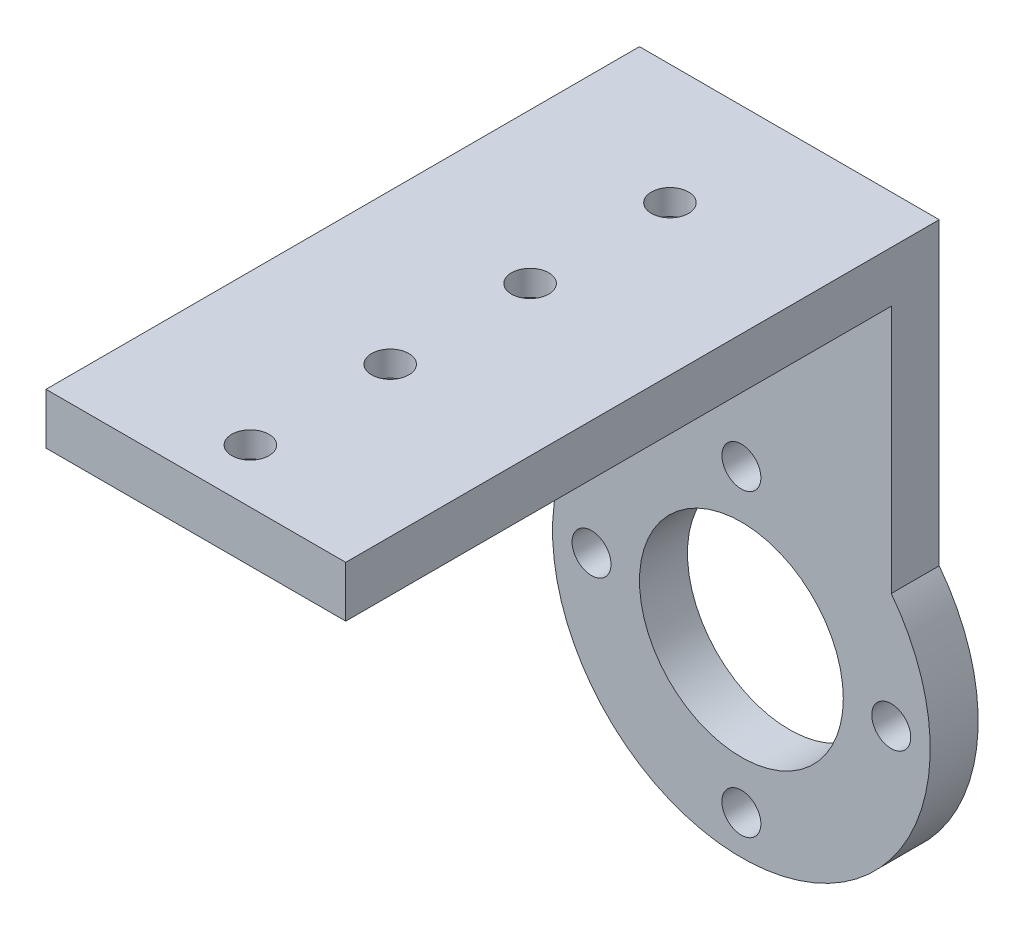
ISO-10303-21;
HEADER;
FILE_DESCRIPTION(('STEP AP214'),'2;1');
FILE_NAME('part.step','',(''),(''),'','','');
FILE_SCHEMA(('AUTOMOTIVE_DESIGN { 1 0 10303 214 1 1 1 1 }'));
ENDSEC;
DATA;
#1=APPLICATION_CONTEXT('core data for automotive mechanical design processes');
#2=APPLICATION_PROTOCOL_DEFINITION('international standard','automotive_design',2000,#1);
#3=PRODUCT_CONTEXT('',#1,'mechanical');
#4=PRODUCT('Part','Part','',(#3));
#5=PRODUCT_RELATED_PRODUCT_CATEGORY('part','',(#4));
#6=PRODUCT_DEFINITION_FORMATION('','',#4);
#7=PRODUCT_DEFINITION_CONTEXT('part definition',#1,'design');
#8=PRODUCT_DEFINITION('design','',#6,#7);
#9=PRODUCT_DEFINITION_SHAPE('','',#8);
#10=(LENGTH_UNIT() NAMED_UNIT(*) SI_UNIT(.MILLI.,.METRE.));
#11=(NAMED_UNIT(*) PLANE_ANGLE_UNIT() SI_UNIT($,.RADIAN.));
#12=(NAMED_UNIT(*) SI_UNIT($,.STERADIAN.) SOLID_ANGLE_UNIT());
#13=UNCERTAINTY_MEASURE_WITH_UNIT(LENGTH_MEASURE(1.E-05),#10,'distance_accuracy_value','');
#14=(GEOMETRIC_REPRESENTATION_CONTEXT(3) GLOBAL_UNCERTAINTY_ASSIGNED_CONTEXT((#13)) GLOBAL_UNIT_ASSIGNED_CONTEXT((#10,
#11,#12)) REPRESENTATION_CONTEXT('',''));
#15=CARTESIAN_POINT('',(0.,0.,0.));
#16=DIRECTION('',(0.,0.,1.));
#17=DIRECTION('',(1.,0.,0.));
#18=AXIS2_PLACEMENT_3D('',#15,#16,#17);
#19=CARTESIAN_POINT('',(0.0883987136924592,70.6637678967368,20.));
#20=DIRECTION('',(0.,-1.,0.));
#21=DIRECTION('',(0.,0.,-1.));
#22=AXIS2_PLACEMENT_3D('',#19,#20,#21);
#23=CYLINDRICAL_SURFACE('',#22,3.1);
#24=CARTESIAN_POINT('',(0.0883987136924592,69.1637678967368,20.));
#25=DIRECTION('',(0.,1.,0.));
#26=DIRECTION('',(0.,0.,1.));
#27=AXIS2_PLACEMENT_3D('',#24,#25,#26);
#28=CIRCLE('',#27,3.1);
#29=CARTESIAN_POINT('',(0.0883987136924592,69.1637678967368,23.1));
#30=VERTEX_POINT('',#29);
#31=EDGE_CURVE('E114',#30,#30,#28,.T.);
#32=ORIENTED_EDGE('',*,*,#31,.T.);
#33=EDGE_LOOP('',(#32));
#34=FACE_BOUND('',#33,.T.);
#35=CARTESIAN_POINT('',(0.0883987136924592,64.9637678967368,20.));
#36=DIRECTION('',(0.,-1.,0.));
#37=DIRECTION('',(0.,0.,-1.));
#38=AXIS2_PLACEMENT_3D('',#35,#36,#37);
#39=CIRCLE('',#38,3.1);
#40=CARTESIAN_POINT('',(0.0883987136924592,64.9637678967368,16.9));
#41=VERTEX_POINT('',#40);
#42=EDGE_CURVE('E476',#41,#41,#39,.T.);
#43=ORIENTED_EDGE('',*,*,#42,.T.);
#44=EDGE_LOOP('',(#43));
#45=FACE_BOUND('',#44,.T.);
#46=ADVANCED_FACE('F37',(#34,#45),#23,.F.);
#47=CARTESIAN_POINT('',(0.0883987136924592,70.6637678967368,43.333));
#48=DIRECTION('',(0.,-1.,0.));
#49=DIRECTION('',(0.,0.,-1.));
#50=AXIS2_PLACEMENT_3D('',#47,#48,#49);
#51=CYLINDRICAL_SURFACE('',#50,3.1);
#52=CARTESIAN_POINT('',(0.0883987136924592,69.1637678967368,43.333));
#53=DIRECTION('',(0.,1.,0.));
#54=DIRECTION('',(0.,0.,1.));
#55=AXIS2_PLACEMENT_3D('',#52,#53,#54);
#56=CIRCLE('',#55,3.1);
#57=CARTESIAN_POINT('',(0.0883987136924592,69.1637678967368,46.433));
#58=VERTEX_POINT('',#57);
#59=EDGE_CURVE('E119',#58,#58,#56,.T.);
#60=ORIENTED_EDGE('',*,*,#59,.T.);
#61=EDGE_LOOP('',(#60));
#62=FACE_BOUND('',#61,.T.);
#63=CARTESIAN_POINT('',(0.0883987136924592,64.9637678967368,43.333));
#64=DIRECTION('',(0.,-1.,0.));
#65=DIRECTION('',(0.,0.,-1.));
#66=AXIS2_PLACEMENT_3D('',#63,#64,#65);
#67=CIRCLE('',#66,3.1);
#68=CARTESIAN_POINT('',(0.0883987136924592,64.9637678967368,40.233));
#69=VERTEX_POINT('',#68);
#70=EDGE_CURVE('E465',#69,#69,#67,.T.);
#71=ORIENTED_EDGE('',*,*,#70,.T.);
#72=EDGE_LOOP('',(#71));
#73=FACE_BOUND('',#72,.T.);
#74=ADVANCED_FACE('F211',(#62,#73),#51,.F.);
#75=CARTESIAN_POINT('',(0.0883987136924592,70.6637678967368,66.66667));
#76=DIRECTION('',(0.,-1.,0.));
#77=DIRECTION('',(0.,0.,-1.));
#78=AXIS2_PLACEMENT_3D('',#75,#76,#77);
#79=CYLINDRICAL_SURFACE('',#78,3.10000000000001);
#80=CARTESIAN_POINT('',(0.0883987136924592,69.1637678967368,66.66667));
#81=DIRECTION('',(0.,1.,0.));
#82=DIRECTION('',(0.,0.,1.));
#83=AXIS2_PLACEMENT_3D('',#80,#81,#82);
#84=CIRCLE('',#83,3.10000000000001);
#85=CARTESIAN_POINT('',(0.0883987136924592,69.1637678967368,69.76667));
#86=VERTEX_POINT('',#85);
#87=EDGE_CURVE('E136',#86,#86,#84,.T.);
#88=ORIENTED_EDGE('',*,*,#87,.T.);
#89=EDGE_LOOP('',(#88));
#90=FACE_BOUND('',#89,.T.);
#91=CARTESIAN_POINT('',(0.0883987136924592,64.9637678967368,66.66667));
#92=DIRECTION('',(0.,-1.,0.));
#93=DIRECTION('',(0.,0.,-1.));
#94=AXIS2_PLACEMENT_3D('',#91,#92,#93);
#95=CIRCLE('',#94,3.10000000000001);
#96=CARTESIAN_POINT('',(0.0883987136924592,64.9637678967368,63.56667));
#97=VERTEX_POINT('',#96);
#98=EDGE_CURVE('E122',#97,#97,#95,.T.);
#99=ORIENTED_EDGE('',*,*,#98,.T.);
#100=EDGE_LOOP('',(#99));
#101=FACE_BOUND('',#100,.T.);
#102=ADVANCED_FACE('F217',(#90,#101),#79,.F.);
#103=CARTESIAN_POINT('',(0.0883987136924592,70.6637678967368,90.));
#104=DIRECTION('',(0.,-1.,0.));
#105=DIRECTION('',(0.,0.,-1.));
#106=AXIS2_PLACEMENT_3D('',#103,#104,#105);
#107=CYLINDRICAL_SURFACE('',#106,3.10000000000001);
#108=CARTESIAN_POINT('',(0.0883987136924592,69.1637678967368,90.));
#109=DIRECTION('',(0.,1.,0.));
#110=DIRECTION('',(0.,0.,1.));
#111=AXIS2_PLACEMENT_3D('',#108,#109,#110);
#112=CIRCLE('',#111,3.10000000000001);
#113=CARTESIAN_POINT('',(0.0883987136924592,69.1637678967368,93.1));
#114=VERTEX_POINT('',#113);
#115=EDGE_CURVE('E139',#114,#114,#112,.T.);
#116=ORIENTED_EDGE('',*,*,#115,.T.);
#117=EDGE_LOOP('',(#116));
#118=FACE_BOUND('',#117,.T.);
#119=CARTESIAN_POINT('',(0.0883987136924592,64.9637678967368,90.));
#120=DIRECTION('',(0.,-1.,0.));
#121=DIRECTION('',(0.,0.,-1.));
#122=AXIS2_PLACEMENT_3D('',#119,#120,#121);
#123=CIRCLE('',#122,3.10000000000001);
#124=CARTESIAN_POINT('',(0.0883987136924592,64.9637678967368,86.9));
#125=VERTEX_POINT('',#124);
#126=EDGE_CURVE('E112',#125,#125,#123,.F.);
#127=ORIENTED_EDGE('',*,*,#126,.F.);
#128=EDGE_LOOP('',(#127));
#129=FACE_BOUND('',#128,.T.);
#130=ADVANCED_FACE('F206',(#118,#129),#107,.F.);
#131=CARTESIAN_POINT('',(0.,0.,8.));
#132=DIRECTION('',(0.,0.,-1.));
#133=DIRECTION('',(-1.,0.,0.));
#134=AXIS2_PLACEMENT_3D('',#131,#132,#133);
#135=CYLINDRICAL_SURFACE('',#134,31.5);
#136=DIRECTION('',(0.,0.,-1.));
#137=VECTOR('',#136,1.);
#138=CARTESIAN_POINT('',(25.,19.1637678967368,4.));
#139=LINE('',#138,#137);
#140=CARTESIAN_POINT('',(25.,19.1637678967368,8.));
#141=VERTEX_POINT('',#140);
#142=CARTESIAN_POINT('',(25.,19.1637678967368,0.));
#143=VERTEX_POINT('',#142);
#144=EDGE_CURVE('E88',#141,#143,#139,.T.);
#145=ORIENTED_EDGE('',*,*,#144,.F.);
#146=CARTESIAN_POINT('',(0.,0.,8.));
#147=DIRECTION('',(0.,0.,1.));
#148=DIRECTION('',(1.,0.,0.));
#149=AXIS2_PLACEMENT_3D('',#146,#147,#148);
#150=CIRCLE('',#149,31.5);
#151=CARTESIAN_POINT('',(-25.,19.1637678967368,8.));
#152=VERTEX_POINT('',#151);
#153=EDGE_CURVE('E45',#152,#141,#150,.T.);
#154=ORIENTED_EDGE('',*,*,#153,.F.);
#155=DIRECTION('',(0.,0.,-1.));
#156=VECTOR('',#155,1.);
#157=CARTESIAN_POINT('',(-25.,19.1637678967368,4.));
#158=LINE('',#157,#156);
#159=CARTESIAN_POINT('',(-25.,19.1637678967368,0.));
#160=VERTEX_POINT('',#159);
#161=EDGE_CURVE('E164',#152,#160,#158,.T.);
#162=ORIENTED_EDGE('',*,*,#161,.T.);
#163=CARTESIAN_POINT('',(0.,0.,0.));
#164=DIRECTION('',(0.,0.,1.));
#165=DIRECTION('',(1.,0.,0.));
#166=AXIS2_PLACEMENT_3D('',#163,#164,#165);
#167=CIRCLE('',#166,31.5);
#168=EDGE_CURVE('E59',#160,#143,#167,.T.);
#169=ORIENTED_EDGE('',*,*,#168,.T.);
#170=EDGE_LOOP('',(#145,#154,#162,#169));
#171=FACE_BOUND('',#170,.T.);
#172=ADVANCED_FACE('F39',(#171),#135,.T.);
#173=CARTESIAN_POINT('',(0.,0.,8.));
#174=DIRECTION('',(0.,0.,1.));
#175=DIRECTION('',(1.,0.,0.));
#176=AXIS2_PLACEMENT_3D('',#173,#174,#175);
#177=PLANE('',#176);
#178=CARTESIAN_POINT('',(0.,0.,8.));
#179=DIRECTION('',(0.,0.,1.));
#180=DIRECTION('',(1.,0.,0.));
#181=AXIS2_PLACEMENT_3D('',#178,#179,#180);
#182=CIRCLE('',#181,17.);
#183=CARTESIAN_POINT('',(17.,0.,8.));
#184=VERTEX_POINT('',#183);
#185=EDGE_CURVE('E101',#184,#184,#182,.T.);
#186=ORIENTED_EDGE('',*,*,#185,.F.);
#187=EDGE_LOOP('',(#186));
#188=FACE_BOUND('',#187,.T.);
#189=CARTESIAN_POINT('',(0.,25.,8.));
#190=DIRECTION('',(0.,0.,1.));
#191=DIRECTION('',(1.,0.,0.));
#192=AXIS2_PLACEMENT_3D('',#189,#190,#191);
#193=CIRCLE('',#192,3.25);
#194=CARTESIAN_POINT('',(3.25000000000001,25.,8.));
#195=VERTEX_POINT('',#194);
#196=EDGE_CURVE('E107',#195,#195,#193,.T.);
#197=ORIENTED_EDGE('',*,*,#196,.F.);
#198=EDGE_LOOP('',(#197));
#199=FACE_BOUND('',#198,.T.);
#200=CARTESIAN_POINT('',(25.,0.,8.));
#201=DIRECTION('',(0.,0.,1.));
#202=DIRECTION('',(1.,0.,0.));
#203=AXIS2_PLACEMENT_3D('',#200,#201,#202);
#204=CIRCLE('',#203,3.25);
#205=CARTESIAN_POINT('',(28.25,0.,8.));
#206=VERTEX_POINT('',#205);
#207=EDGE_CURVE('E179',#206,#206,#204,.T.);
#208=ORIENTED_EDGE('',*,*,#207,.F.);
#209=EDGE_LOOP('',(#208));
#210=FACE_BOUND('',#209,.T.);
#211=CARTESIAN_POINT('',(0.,-25.,8.));
#212=DIRECTION('',(0.,0.,1.));
#213=DIRECTION('',(1.,0.,0.));
#214=AXIS2_PLACEMENT_3D('',#211,#212,#213);
#215=CIRCLE('',#214,3.25);
#216=CARTESIAN_POINT('',(3.25000000000001,-25.,8.));
#217=VERTEX_POINT('',#216);
#218=EDGE_CURVE('E185',#217,#217,#215,.T.);
#219=ORIENTED_EDGE('',*,*,#218,.F.);
#220=EDGE_LOOP('',(#219));
#221=FACE_BOUND('',#220,.T.);
#222=CARTESIAN_POINT('',(-25.,0.,8.));
#223=DIRECTION('',(0.,0.,1.));
#224=DIRECTION('',(1.,0.,0.));
#225=AXIS2_PLACEMENT_3D('',#222,#223,#224);
#226=CIRCLE('',#225,3.25);
#227=CARTESIAN_POINT('',(-21.75,0.,8.));
#228=VERTEX_POINT('',#227);
#229=EDGE_CURVE('E110',#228,#228,#226,.T.);
#230=ORIENTED_EDGE('',*,*,#229,.F.);
#231=EDGE_LOOP('',(#230));
#232=FACE_BOUND('',#231,.T.);
#233=ORIENTED_EDGE('',*,*,#153,.T.);
#234=DIRECTION('',(0.,-1.,0.));
#235=VECTOR('',#234,1.);
#236=CARTESIAN_POINT('',(25.,0.,8.));
#237=LINE('',#236,#235);
#238=CARTESIAN_POINT('',(25.,60.6637678967368,8.00000000000001));
#239=VERTEX_POINT('',#238);
#240=EDGE_CURVE('E52',#239,#141,#237,.T.);
#241=ORIENTED_EDGE('',*,*,#240,.F.);
#242=DIRECTION('',(1.,0.,0.));
#243=VECTOR('',#242,1.);
#244=CARTESIAN_POINT('',(-25.,60.6637678967368,8.00000000000001));
#245=LINE('',#244,#243);
#246=CARTESIAN_POINT('',(-25.,60.6637678967368,8.));
#247=VERTEX_POINT('',#246);
#248=EDGE_CURVE('E11',#247,#239,#245,.T.);
#249=ORIENTED_EDGE('',*,*,#248,.F.);
#250=DIRECTION('',(0.,-1.,0.));
#251=VECTOR('',#250,1.);
#252=CARTESIAN_POINT('',(-25.,0.,8.));
#253=LINE('',#252,#251);
#254=EDGE_CURVE('E100',#247,#152,#253,.T.);
#255=ORIENTED_EDGE('',*,*,#254,.T.);
#256=EDGE_LOOP('',(#233,#241,#249,#255));
#257=FACE_BOUND('',#256,.T.);
#258=ADVANCED_FACE('F104',(#188,#199,#210,#221,#232,#257),#177,.T.);
#259=CARTESIAN_POINT('',(0.,0.,0.));
#260=DIRECTION('',(0.,0.,1.));
#261=DIRECTION('',(1.,0.,0.));
#262=AXIS2_PLACEMENT_3D('',#259,#260,#261);
#263=PLANE('',#262);
#264=CARTESIAN_POINT('',(0.,0.,0.));
#265=DIRECTION('',(0.,0.,1.));
#266=DIRECTION('',(1.,0.,0.));
#267=AXIS2_PLACEMENT_3D('',#264,#265,#266);
#268=CIRCLE('',#267,17.);
#269=CARTESIAN_POINT('',(17.,0.,0.));
#270=VERTEX_POINT('',#269);
#271=EDGE_CURVE('E92',#270,#270,#268,.T.);
#272=ORIENTED_EDGE('',*,*,#271,.T.);
#273=EDGE_LOOP('',(#272));
#274=FACE_BOUND('',#273,.T.);
#275=CARTESIAN_POINT('',(0.,25.,0.));
#276=DIRECTION('',(0.,0.,1.));
#277=DIRECTION('',(1.,0.,0.));
#278=AXIS2_PLACEMENT_3D('',#275,#276,#277);
#279=CIRCLE('',#278,3.25);
#280=CARTESIAN_POINT('',(3.25000000000001,25.,0.));
#281=VERTEX_POINT('',#280);
#282=EDGE_CURVE('E173',#281,#281,#279,.T.);
#283=ORIENTED_EDGE('',*,*,#282,.T.);
#284=EDGE_LOOP('',(#283));
#285=FACE_BOUND('',#284,.T.);
#286=CARTESIAN_POINT('',(25.,0.,0.));
#287=DIRECTION('',(0.,0.,1.));
#288=DIRECTION('',(1.,0.,0.));
#289=AXIS2_PLACEMENT_3D('',#286,#287,#288);
#290=CIRCLE('',#289,3.25);
#291=CARTESIAN_POINT('',(28.25,0.,0.));
#292=VERTEX_POINT('',#291);
#293=EDGE_CURVE('E176',#292,#292,#290,.T.);
#294=ORIENTED_EDGE('',*,*,#293,.T.);
#295=EDGE_LOOP('',(#294));
#296=FACE_BOUND('',#295,.T.);
#297=CARTESIAN_POINT('',(0.,-25.,0.));
#298=DIRECTION('',(0.,0.,1.));
#299=DIRECTION('',(1.,0.,0.));
#300=AXIS2_PLACEMENT_3D('',#297,#298,#299);
#301=CIRCLE('',#300,3.25);
#302=CARTESIAN_POINT('',(3.25000000000001,-25.,0.));
#303=VERTEX_POINT('',#302);
#304=EDGE_CURVE('E182',#303,#303,#301,.T.);
#305=ORIENTED_EDGE('',*,*,#304,.T.);
#306=EDGE_LOOP('',(#305));
#307=FACE_BOUND('',#306,.T.);
#308=CARTESIAN_POINT('',(-25.,0.,0.));
#309=DIRECTION('',(0.,0.,1.));
#310=DIRECTION('',(1.,0.,0.));
#311=AXIS2_PLACEMENT_3D('',#308,#309,#310);
#312=CIRCLE('',#311,3.25);
#313=CARTESIAN_POINT('',(-21.75,0.,0.));
#314=VERTEX_POINT('',#313);
#315=EDGE_CURVE('E187',#314,#314,#312,.T.);
#316=ORIENTED_EDGE('',*,*,#315,.T.);
#317=EDGE_LOOP('',(#316));
#318=FACE_BOUND('',#317,.T.);
#319=ORIENTED_EDGE('',*,*,#168,.F.);
#320=DIRECTION('',(0.,-1.,0.));
#321=VECTOR('',#320,1.);
#322=CARTESIAN_POINT('',(-25.,0.,0.));
#323=LINE('',#322,#321);
#324=CARTESIAN_POINT('',(-25.,69.1637678967368,0.));
#325=VERTEX_POINT('',#324);
#326=EDGE_CURVE('E161',#325,#160,#323,.T.);
#327=ORIENTED_EDGE('',*,*,#326,.F.);
#328=DIRECTION('',(1.,0.,0.));
#329=VECTOR('',#328,1.);
#330=CARTESIAN_POINT('',(0.,69.1637678967368,0.));
#331=LINE('',#330,#329);
#332=CARTESIAN_POINT('',(25.,69.1637678967368,0.));
#333=VERTEX_POINT('',#332);
#334=EDGE_CURVE('E158',#325,#333,#331,.T.);
#335=ORIENTED_EDGE('',*,*,#334,.T.);
#336=DIRECTION('',(0.,-1.,0.));
#337=VECTOR('',#336,1.);
#338=CARTESIAN_POINT('',(25.,0.,0.));
#339=LINE('',#338,#337);
#340=EDGE_CURVE('E156',#333,#143,#339,.T.);
#341=ORIENTED_EDGE('',*,*,#340,.T.);
#342=EDGE_LOOP('',(#319,#327,#335,#341));
#343=FACE_BOUND('',#342,.T.);
#344=ADVANCED_FACE('F198',(#274,#285,#296,#307,#318,#343),#263,.F.);
#345=CARTESIAN_POINT('',(-25.,0.,8.));
#346=DIRECTION('',(0.,0.,-1.));
#347=DIRECTION('',(-1.,0.,0.));
#348=AXIS2_PLACEMENT_3D('',#345,#346,#347);
#349=CYLINDRICAL_SURFACE('',#348,3.25);
#350=ORIENTED_EDGE('',*,*,#229,.T.);
#351=EDGE_LOOP('',(#350));
#352=FACE_BOUND('',#351,.T.);
#353=ORIENTED_EDGE('',*,*,#315,.F.);
#354=EDGE_LOOP('',(#353));
#355=FACE_BOUND('',#354,.T.);
#356=ADVANCED_FACE('F194',(#352,#355),#349,.F.);
#357=CARTESIAN_POINT('',(0.,-25.,8.));
#358=DIRECTION('',(0.,0.,-1.));
#359=DIRECTION('',(-1.,0.,0.));
#360=AXIS2_PLACEMENT_3D('',#357,#358,#359);
#361=CYLINDRICAL_SURFACE('',#360,3.25);
#362=ORIENTED_EDGE('',*,*,#218,.T.);
#363=EDGE_LOOP('',(#362));
#364=FACE_BOUND('',#363,.T.);
#365=ORIENTED_EDGE('',*,*,#304,.F.);
#366=EDGE_LOOP('',(#365));
#367=FACE_BOUND('',#366,.T.);
#368=ADVANCED_FACE('F253',(#364,#367),#361,.F.);
#369=CARTESIAN_POINT('',(25.,0.,8.));
#370=DIRECTION('',(0.,0.,-1.));
#371=DIRECTION('',(-1.,0.,0.));
#372=AXIS2_PLACEMENT_3D('',#369,#370,#371);
#373=CYLINDRICAL_SURFACE('',#372,3.25);
#374=ORIENTED_EDGE('',*,*,#207,.T.);
#375=EDGE_LOOP('',(#374));
#376=FACE_BOUND('',#375,.T.);
#377=ORIENTED_EDGE('',*,*,#293,.F.);
#378=EDGE_LOOP('',(#377));
#379=FACE_BOUND('',#378,.T.);
#380=ADVANCED_FACE('F249',(#376,#379),#373,.F.);
#381=CARTESIAN_POINT('',(0.,25.,8.));
#382=DIRECTION('',(0.,0.,-1.));
#383=DIRECTION('',(-1.,0.,0.));
#384=AXIS2_PLACEMENT_3D('',#381,#382,#383);
#385=CYLINDRICAL_SURFACE('',#384,3.25);
#386=ORIENTED_EDGE('',*,*,#196,.T.);
#387=EDGE_LOOP('',(#386));
#388=FACE_BOUND('',#387,.T.);
#389=ORIENTED_EDGE('',*,*,#282,.F.);
#390=EDGE_LOOP('',(#389));
#391=FACE_BOUND('',#390,.T.);
#392=ADVANCED_FACE('F245',(#388,#391),#385,.F.);
#393=CARTESIAN_POINT('',(0.,0.,6.));
#394=DIRECTION('',(0.,0.,-1.));
#395=DIRECTION('',(-1.,0.,0.));
#396=AXIS2_PLACEMENT_3D('',#393,#394,#395);
#397=CYLINDRICAL_SURFACE('',#396,17.);
#398=ORIENTED_EDGE('',*,*,#271,.F.);
#399=EDGE_LOOP('',(#398));
#400=FACE_BOUND('',#399,.T.);
#401=ORIENTED_EDGE('',*,*,#185,.T.);
#402=EDGE_LOOP('',(#401));
#403=FACE_BOUND('',#402,.T.);
#404=ADVANCED_FACE('F242',(#400,#403),#397,.F.);
#405=CARTESIAN_POINT('',(25.,0.,4.));
#406=DIRECTION('',(1.,0.,0.));
#407=DIRECTION('',(0.,1.,0.));
#408=AXIS2_PLACEMENT_3D('',#405,#406,#407);
#409=PLANE('',#408);
#410=ORIENTED_EDGE('',*,*,#240,.T.);
#411=ORIENTED_EDGE('',*,*,#144,.T.);
#412=ORIENTED_EDGE('',*,*,#340,.F.);
#413=DIRECTION('',(0.,0.,-1.));
#414=VECTOR('',#413,1.);
#415=CARTESIAN_POINT('',(25.,69.1637678967368,4.));
#416=LINE('',#415,#414);
#417=CARTESIAN_POINT('',(25.,69.1637678967368,99.));
#418=VERTEX_POINT('',#417);
#419=EDGE_CURVE('E93',#418,#333,#416,.T.);
#420=ORIENTED_EDGE('',*,*,#419,.F.);
#421=DIRECTION('',(0.,1.,0.));
#422=VECTOR('',#421,1.);
#423=CARTESIAN_POINT('',(25.,60.6637678967368,99.));
#424=LINE('',#423,#422);
#425=CARTESIAN_POINT('',(25.,60.6637678967368,99.));
#426=VERTEX_POINT('',#425);
#427=EDGE_CURVE('E149',#426,#418,#424,.T.);
#428=ORIENTED_EDGE('',*,*,#427,.F.);
#429=DIRECTION('',(0.,0.,-1.));
#430=VECTOR('',#429,1.);
#431=CARTESIAN_POINT('',(25.,60.6637678967368,99.));
#432=LINE('',#431,#430);
#433=EDGE_CURVE('E99',#426,#239,#432,.T.);
#434=ORIENTED_EDGE('',*,*,#433,.T.);
#435=EDGE_LOOP('',(#410,#411,#412,#420,#428,#434));
#436=FACE_BOUND('',#435,.T.);
#437=ADVANCED_FACE('F96',(#436),#409,.T.);
#438=CARTESIAN_POINT('',(0.,69.1637678967368,4.));
#439=DIRECTION('',(0.,1.,0.));
#440=DIRECTION('',(0.,0.,1.));
#441=AXIS2_PLACEMENT_3D('',#438,#439,#440);
#442=PLANE('',#441);
#443=ORIENTED_EDGE('',*,*,#419,.T.);
#444=ORIENTED_EDGE('',*,*,#334,.F.);
#445=DIRECTION('',(0.,0.,-1.));
#446=VECTOR('',#445,1.);
#447=CARTESIAN_POINT('',(-25.,69.1637678967368,4.));
#448=LINE('',#447,#446);
#449=CARTESIAN_POINT('',(-25.,69.1637678967368,99.));
#450=VERTEX_POINT('',#449);
#451=EDGE_CURVE('E166',#450,#325,#448,.T.);
#452=ORIENTED_EDGE('',*,*,#451,.F.);
#453=DIRECTION('',(-1.,0.,0.));
#454=VECTOR('',#453,1.);
#455=CARTESIAN_POINT('',(25.,69.1637678967368,99.));
#456=LINE('',#455,#454);
#457=EDGE_CURVE('E142',#418,#450,#456,.T.);
#458=ORIENTED_EDGE('',*,*,#457,.F.);
#459=EDGE_LOOP('',(#443,#444,#452,#458));
#460=FACE_BOUND('',#459,.T.);
#461=ORIENTED_EDGE('',*,*,#115,.F.);
#462=EDGE_LOOP('',(#461));
#463=FACE_BOUND('',#462,.T.);
#464=ORIENTED_EDGE('',*,*,#87,.F.);
#465=EDGE_LOOP('',(#464));
#466=FACE_BOUND('',#465,.T.);
#467=ORIENTED_EDGE('',*,*,#59,.F.);
#468=EDGE_LOOP('',(#467));
#469=FACE_BOUND('',#468,.T.);
#470=ORIENTED_EDGE('',*,*,#31,.F.);
#471=EDGE_LOOP('',(#470));
#472=FACE_BOUND('',#471,.T.);
#473=ADVANCED_FACE('F235',(#460,#463,#466,#469,#472),#442,.T.);
#474=CARTESIAN_POINT('',(-25.,0.,4.));
#475=DIRECTION('',(1.,0.,0.));
#476=DIRECTION('',(0.,1.,0.));
#477=AXIS2_PLACEMENT_3D('',#474,#475,#476);
#478=PLANE('',#477);
#479=ORIENTED_EDGE('',*,*,#161,.F.);
#480=ORIENTED_EDGE('',*,*,#254,.F.);
#481=DIRECTION('',(0.,0.,-1.));
#482=VECTOR('',#481,1.);
#483=CARTESIAN_POINT('',(-25.,60.6637678967368,99.));
#484=LINE('',#483,#482);
#485=CARTESIAN_POINT('',(-25.,60.6637678967368,99.));
#486=VERTEX_POINT('',#485);
#487=EDGE_CURVE('E153',#486,#247,#484,.T.);
#488=ORIENTED_EDGE('',*,*,#487,.F.);
#489=DIRECTION('',(0.,-1.,0.));
#490=VECTOR('',#489,1.);
#491=CARTESIAN_POINT('',(-25.,69.1637678967368,99.));
#492=LINE('',#491,#490);
#493=EDGE_CURVE('E145',#450,#486,#492,.T.);
#494=ORIENTED_EDGE('',*,*,#493,.F.);
#495=ORIENTED_EDGE('',*,*,#451,.T.);
#496=ORIENTED_EDGE('',*,*,#326,.T.);
#497=EDGE_LOOP('',(#479,#480,#488,#494,#495,#496));
#498=FACE_BOUND('',#497,.T.);
#499=ADVANCED_FACE('F231',(#498),#478,.F.);
#500=CARTESIAN_POINT('',(-25.,60.6637678967368,99.));
#501=DIRECTION('',(0.,1.,0.));
#502=DIRECTION('',(0.,0.,1.));
#503=AXIS2_PLACEMENT_3D('',#500,#501,#502);
#504=PLANE('',#503);
#505=CARTESIAN_POINT('',(0.0883987136924592,60.6637678967368,90.));
#506=DIRECTION('',(0.,-1.,0.));
#507=DIRECTION('',(0.,0.,-1.));
#508=AXIS2_PLACEMENT_3D('',#505,#506,#507);
#509=CIRCLE('',#508,6.75000000000001);
#510=CARTESIAN_POINT('',(0.0883987136924592,60.6637678967368,83.25));
#511=VERTEX_POINT('',#510);
#512=EDGE_CURVE('E480',#511,#511,#509,.T.);
#513=ORIENTED_EDGE('',*,*,#512,.F.);
#514=EDGE_LOOP('',(#513));
#515=FACE_BOUND('',#514,.T.);
#516=CARTESIAN_POINT('',(0.0883987136924592,60.6637678967368,20.));
#517=DIRECTION('',(0.,-1.,0.));
#518=DIRECTION('',(0.,0.,-1.));
#519=AXIS2_PLACEMENT_3D('',#516,#517,#518);
#520=CIRCLE('',#519,6.75);
#521=CARTESIAN_POINT('',(0.0883987136924592,60.6637678967368,13.25));
#522=VERTEX_POINT('',#521);
#523=EDGE_CURVE('E471',#522,#522,#520,.T.);
#524=ORIENTED_EDGE('',*,*,#523,.F.);
#525=EDGE_LOOP('',(#524));
#526=FACE_BOUND('',#525,.T.);
#527=CARTESIAN_POINT('',(0.0883987136924592,60.6637678967368,43.333));
#528=DIRECTION('',(0.,-1.,0.));
#529=DIRECTION('',(0.,0.,-1.));
#530=AXIS2_PLACEMENT_3D('',#527,#528,#529);
#531=CIRCLE('',#530,6.75);
#532=CARTESIAN_POINT('',(0.0883987136924592,60.6637678967368,36.583));
#533=VERTEX_POINT('',#532);
#534=EDGE_CURVE('E132',#533,#533,#531,.T.);
#535=ORIENTED_EDGE('',*,*,#534,.F.);
#536=EDGE_LOOP('',(#535));
#537=FACE_BOUND('',#536,.T.);
#538=CARTESIAN_POINT('',(0.0883987136924592,60.6637678967368,66.66667));
#539=DIRECTION('',(0.,-1.,0.));
#540=DIRECTION('',(0.,0.,-1.));
#541=AXIS2_PLACEMENT_3D('',#538,#539,#540);
#542=CIRCLE('',#541,6.75);
#543=CARTESIAN_POINT('',(0.0883987136924592,60.6637678967368,59.91667));
#544=VERTEX_POINT('',#543);
#545=EDGE_CURVE('E127',#544,#544,#542,.T.);
#546=ORIENTED_EDGE('',*,*,#545,.F.);
#547=EDGE_LOOP('',(#546));
#548=FACE_BOUND('',#547,.T.);
#549=ORIENTED_EDGE('',*,*,#487,.T.);
#550=ORIENTED_EDGE('',*,*,#248,.T.);
#551=ORIENTED_EDGE('',*,*,#433,.F.);
#552=DIRECTION('',(1.,0.,0.));
#553=VECTOR('',#552,1.);
#554=CARTESIAN_POINT('',(-25.,60.6637678967368,99.));
#555=LINE('',#554,#553);
#556=EDGE_CURVE('E147',#486,#426,#555,.T.);
#557=ORIENTED_EDGE('',*,*,#556,.F.);
#558=EDGE_LOOP('',(#549,#550,#551,#557));
#559=FACE_BOUND('',#558,.T.);
#560=ADVANCED_FACE('F227',(#515,#526,#537,#548,#559),#504,.F.);
#561=CARTESIAN_POINT('',(0.,0.,99.));
#562=DIRECTION('',(0.,0.,1.));
#563=DIRECTION('',(1.,0.,0.));
#564=AXIS2_PLACEMENT_3D('',#561,#562,#563);
#565=PLANE('',#564);
#566=ORIENTED_EDGE('',*,*,#457,.T.);
#567=ORIENTED_EDGE('',*,*,#493,.T.);
#568=ORIENTED_EDGE('',*,*,#556,.T.);
#569=ORIENTED_EDGE('',*,*,#427,.T.);
#570=EDGE_LOOP('',(#566,#567,#568,#569));
#571=FACE_BOUND('',#570,.T.);
#572=ADVANCED_FACE('F223',(#571),#565,.T.);
#573=CARTESIAN_POINT('',(0.0883987136924592,64.9637678967368,90.));
#574=DIRECTION('',(0.,-1.,0.));
#575=DIRECTION('',(0.,0.,-1.));
#576=AXIS2_PLACEMENT_3D('',#573,#574,#575);
#577=PLANE('',#576);
#578=CARTESIAN_POINT('',(0.0883987136924592,64.9637678967368,90.));
#579=DIRECTION('',(0.,-1.,0.));
#580=DIRECTION('',(0.,0.,-1.));
#581=AXIS2_PLACEMENT_3D('',#578,#579,#580);
#582=CIRCLE('',#581,6.75000000000001);
#583=CARTESIAN_POINT('',(0.0883987136924592,64.9637678967368,83.25));
#584=VERTEX_POINT('',#583);
#585=EDGE_CURVE('E484',#584,#584,#582,.T.);
#586=ORIENTED_EDGE('',*,*,#585,.T.);
#587=EDGE_LOOP('',(#586));
#588=FACE_BOUND('',#587,.T.);
#589=ORIENTED_EDGE('',*,*,#126,.T.);
#590=EDGE_LOOP('',(#589));
#591=FACE_BOUND('',#590,.T.);
#592=ADVANCED_FACE('F226',(#588,#591),#577,.T.);
#593=CARTESIAN_POINT('',(0.0883987136924592,64.9637678967368,90.));
#594=DIRECTION('',(0.,-1.,0.));
#595=DIRECTION('',(0.,0.,-1.));
#596=AXIS2_PLACEMENT_3D('',#593,#594,#595);
#597=CYLINDRICAL_SURFACE('',#596,6.75000000000001);
#598=CARTESIAN_POINT('',(0.0883987136924592,64.9637678967368,83.25));
#599=CARTESIAN_POINT('',(0.0883987136924592,64.9189762300701,83.25));
#600=CARTESIAN_POINT('',(0.0883987136924592,64.8741845634035,83.25));
#601=CARTESIAN_POINT('',(0.0883987136924592,64.7846012300702,83.25));
#602=CARTESIAN_POINT('',(0.0883987136924592,64.7398095634035,83.25));
#603=CARTESIAN_POINT('',(0.0883987136924592,64.6502262300701,83.25));
#604=CARTESIAN_POINT('',(0.0883987136924592,64.6054345634035,83.25));
#605=CARTESIAN_POINT('',(0.0883987136924592,64.5158512300702,83.25));
#606=CARTESIAN_POINT('',(0.0883987136924592,64.4710595634035,83.25));
#607=CARTESIAN_POINT('',(0.0883987136924592,64.3814762300701,83.25));
#608=CARTESIAN_POINT('',(0.0883987136924592,64.3366845634035,83.25));
#609=CARTESIAN_POINT('',(0.0883987136924592,64.2471012300702,83.25));
#610=CARTESIAN_POINT('',(0.0883987136924592,64.2023095634035,83.25));
#611=CARTESIAN_POINT('',(0.0883987136924592,64.1127262300702,83.25));
#612=CARTESIAN_POINT('',(0.0883987136924592,64.0679345634035,83.25));
#613=CARTESIAN_POINT('',(0.0883987136924592,63.9783512300701,83.25));
#614=CARTESIAN_POINT('',(0.0883987136924592,63.9335595634035,83.25));
#615=CARTESIAN_POINT('',(0.0883987136924592,63.8439762300702,83.25));
#616=CARTESIAN_POINT('',(0.0883987136924592,63.7991845634035,83.25));
#617=CARTESIAN_POINT('',(0.0883987136924592,63.7096012300701,83.25));
#618=CARTESIAN_POINT('',(0.0883987136924592,63.6648095634035,83.25));
#619=CARTESIAN_POINT('',(0.0883987136924592,63.5752262300702,83.25));
#620=CARTESIAN_POINT('',(0.0883987136924592,63.5304345634035,83.25));
#621=CARTESIAN_POINT('',(0.0883987136924592,63.4408512300702,83.25));
#622=CARTESIAN_POINT('',(0.0883987136924592,63.3960595634035,83.25));
#623=CARTESIAN_POINT('',(0.0883987136924592,63.3064762300701,83.25));
#624=CARTESIAN_POINT('',(0.0883987136924592,63.2616845634035,83.25));
#625=CARTESIAN_POINT('',(0.0883987136924592,63.1721012300702,83.25));
#626=CARTESIAN_POINT('',(0.0883987136924592,63.1273095634035,83.25));
#627=CARTESIAN_POINT('',(0.0883987136924592,63.0377262300701,83.25));
#628=CARTESIAN_POINT('',(0.0883987136924592,62.9929345634035,83.25));
#629=CARTESIAN_POINT('',(0.0883987136924592,62.9033512300702,83.25));
#630=CARTESIAN_POINT('',(0.0883987136924592,62.8585595634035,83.25));
#631=CARTESIAN_POINT('',(0.0883987136924592,62.7689762300701,83.25));
#632=CARTESIAN_POINT('',(0.0883987136924592,62.7241845634035,83.25));
#633=CARTESIAN_POINT('',(0.0883987136924592,62.6346012300702,83.25));
#634=CARTESIAN_POINT('',(0.0883987136924592,62.5898095634035,83.25));
#635=CARTESIAN_POINT('',(0.0883987136924592,62.5002262300701,83.25));
#636=CARTESIAN_POINT('',(0.0883987136924592,62.4554345634035,83.25));
#637=CARTESIAN_POINT('',(0.0883987136924592,62.3658512300701,83.25));
#638=CARTESIAN_POINT('',(0.0883987136924592,62.3210595634035,83.25));
#639=CARTESIAN_POINT('',(0.0883987136924592,62.2314762300701,83.25));
#640=CARTESIAN_POINT('',(0.0883987136924592,62.1866845634035,83.25));
#641=CARTESIAN_POINT('',(0.0883987136924592,62.0971012300701,83.25));
#642=CARTESIAN_POINT('',(0.0883987136924592,62.0523095634035,83.25));
#643=CARTESIAN_POINT('',(0.0883987136924592,61.9627262300701,83.25));
#644=CARTESIAN_POINT('',(0.0883987136924592,61.9179345634035,83.25));
#645=CARTESIAN_POINT('',(0.0883987136924592,61.8283512300701,83.25));
#646=CARTESIAN_POINT('',(0.0883987136924592,61.7835595634035,83.25));
#647=CARTESIAN_POINT('',(0.0883987136924592,61.6939762300701,83.25));
#648=CARTESIAN_POINT('',(0.0883987136924592,61.6491845634035,83.25));
#649=CARTESIAN_POINT('',(0.0883987136924592,61.5596012300702,83.25));
#650=CARTESIAN_POINT('',(0.0883987136924592,61.5148095634035,83.25));
#651=CARTESIAN_POINT('',(0.0883987136924592,61.4252262300701,83.25));
#652=CARTESIAN_POINT('',(0.0883987136924592,61.3804345634035,83.25));
#653=CARTESIAN_POINT('',(0.0883987136924592,61.2908512300701,83.25));
#654=CARTESIAN_POINT('',(0.0883987136924592,61.2460595634035,83.25));
#655=CARTESIAN_POINT('',(0.0883987136924592,61.1564762300701,83.25));
#656=CARTESIAN_POINT('',(0.0883987136924592,61.1116845634035,83.25));
#657=CARTESIAN_POINT('',(0.0883987136924592,61.0221012300701,83.25));
#658=CARTESIAN_POINT('',(0.0883987136924592,60.9773095634035,83.25));
#659=CARTESIAN_POINT('',(0.0883987136924592,60.8877262300701,83.25));
#660=CARTESIAN_POINT('',(0.0883987136924592,60.8429345634035,83.25));
#661=CARTESIAN_POINT('',(0.0883987136924592,60.7533512300701,83.25));
#662=CARTESIAN_POINT('',(0.0883987136924592,60.7085595634035,83.25));
#663=CARTESIAN_POINT('',(0.0883987136924592,60.6637678967368,83.25));
#664=B_SPLINE_CURVE_WITH_KNOTS('',3,(#598,#599,#600,#601,#602,#603,#604,#605,#606,#607,#608,
#609,#610,#611,#612,#613,#614,#615,#616,#617,#618,#619,#620,#621,#622,#623,#624,#625,#626,#627,
#628,#629,#630,#631,#632,#633,#634,#635,#636,#637,#638,#639,#640,#641,#642,#643,#644,#645,#646,
#647,#648,#649,#650,#651,#652,#653,#654,#655,#656,#657,#658,#659,#660,#661,#662,#663),
.UNSPECIFIED.,.F.,.F.,(4,2,2,2,2,2,2,2,2,2,2,2,2,2,2,2,2,2,2,2,2,2,2,2,2,2,2,2,2,2,2,2,4),(0.,
0.134374999999992,0.268749999999998,0.40312499999999,0.537499999999996,0.671874999999988,
0.806249999999994,0.940625,1.07499999999999,1.209375,1.34374999999999,1.478125,1.6125,
1.74687499999999,1.88125,2.01562499999999,2.15,2.28437499999999,2.41875,2.553125,2.6875,
2.821875,2.95625,3.090625,3.225,3.359375,3.49375,3.628125,3.7625,3.896875,4.03125,
4.16562500000001,4.30000000000001),.UNSPECIFIED.);
#665=EDGE_CURVE('BSEAM304',#584,#511,#664,.T.);
#666=ORIENTED_EDGE('',*,*,#585,.F.);
#667=ORIENTED_EDGE('',*,*,#512,.T.);
#668=ORIENTED_EDGE('',*,*,#665,.T.);
#669=ORIENTED_EDGE('',*,*,#665,.F.);
#670=EDGE_LOOP('',(#666,#668,#667,#669));
#671=FACE_BOUND('',#670,.T.);
#672=ADVANCED_FACE('F304',(#671),#597,.F.);
#673=CARTESIAN_POINT('',(0.0883987136924592,64.9637678967368,66.66667));
#674=DIRECTION('',(0.,-1.,0.));
#675=DIRECTION('',(0.,0.,-1.));
#676=AXIS2_PLACEMENT_3D('',#673,#674,#675);
#677=CYLINDRICAL_SURFACE('',#676,6.75);
#678=CARTESIAN_POINT('',(0.0883987136924592,64.9637678967368,66.66667));
#679=DIRECTION('',(0.,-1.,0.));
#680=DIRECTION('',(0.,0.,-1.));
#681=AXIS2_PLACEMENT_3D('',#678,#679,#680);
#682=CIRCLE('',#681,6.75);
#683=CARTESIAN_POINT('',(0.0883987136924592,64.9637678967368,59.91667));
#684=VERTEX_POINT('',#683);
#685=EDGE_CURVE('E115',#684,#684,#682,.T.);
#686=CARTESIAN_POINT('',(0.0883987136924592,64.9637678967368,59.91667));
#687=CARTESIAN_POINT('',(0.0883987136924592,64.9189762300701,59.91667));
#688=CARTESIAN_POINT('',(0.0883987136924592,64.8741845634035,59.91667));
#689=CARTESIAN_POINT('',(0.0883987136924592,64.7846012300702,59.91667));
#690=CARTESIAN_POINT('',(0.0883987136924592,64.7398095634035,59.91667));
#691=CARTESIAN_POINT('',(0.0883987136924592,64.6502262300701,59.91667));
#692=CARTESIAN_POINT('',(0.0883987136924592,64.6054345634035,59.91667));
#693=CARTESIAN_POINT('',(0.0883987136924592,64.5158512300702,59.91667));
#694=CARTESIAN_POINT('',(0.0883987136924592,64.4710595634035,59.91667));
#695=CARTESIAN_POINT('',(0.0883987136924592,64.3814762300701,59.91667));
#696=CARTESIAN_POINT('',(0.0883987136924592,64.3366845634035,59.91667));
#697=CARTESIAN_POINT('',(0.0883987136924592,64.2471012300702,59.91667));
#698=CARTESIAN_POINT('',(0.0883987136924592,64.2023095634035,59.91667));
#699=CARTESIAN_POINT('',(0.0883987136924592,64.1127262300702,59.91667));
#700=CARTESIAN_POINT('',(0.0883987136924592,64.0679345634035,59.91667));
#701=CARTESIAN_POINT('',(0.0883987136924592,63.9783512300701,59.91667));
#702=CARTESIAN_POINT('',(0.0883987136924592,63.9335595634035,59.91667));
#703=CARTESIAN_POINT('',(0.0883987136924592,63.8439762300702,59.91667));
#704=CARTESIAN_POINT('',(0.0883987136924592,63.7991845634035,59.91667));
#705=CARTESIAN_POINT('',(0.0883987136924592,63.7096012300701,59.91667));
#706=CARTESIAN_POINT('',(0.0883987136924592,63.6648095634035,59.91667));
#707=CARTESIAN_POINT('',(0.0883987136924592,63.5752262300702,59.91667));
#708=CARTESIAN_POINT('',(0.0883987136924592,63.5304345634035,59.91667));
#709=CARTESIAN_POINT('',(0.0883987136924592,63.4408512300702,59.91667));
#710=CARTESIAN_POINT('',(0.0883987136924592,63.3960595634035,59.91667));
#711=CARTESIAN_POINT('',(0.0883987136924592,63.3064762300701,59.91667));
#712=CARTESIAN_POINT('',(0.0883987136924592,63.2616845634035,59.91667));
#713=CARTESIAN_POINT('',(0.0883987136924592,63.1721012300702,59.91667));
#714=CARTESIAN_POINT('',(0.0883987136924592,63.1273095634035,59.91667));
#715=CARTESIAN_POINT('',(0.0883987136924592,63.0377262300701,59.91667));
#716=CARTESIAN_POINT('',(0.0883987136924592,62.9929345634035,59.91667));
#717=CARTESIAN_POINT('',(0.0883987136924592,62.9033512300702,59.91667));
#718=CARTESIAN_POINT('',(0.0883987136924592,62.8585595634035,59.91667));
#719=CARTESIAN_POINT('',(0.0883987136924592,62.7689762300701,59.91667));
#720=CARTESIAN_POINT('',(0.0883987136924592,62.7241845634035,59.91667));
#721=CARTESIAN_POINT('',(0.0883987136924592,62.6346012300702,59.91667));
#722=CARTESIAN_POINT('',(0.0883987136924592,62.5898095634035,59.91667));
#723=CARTESIAN_POINT('',(0.0883987136924592,62.5002262300701,59.91667));
#724=CARTESIAN_POINT('',(0.0883987136924592,62.4554345634035,59.91667));
#725=CARTESIAN_POINT('',(0.0883987136924592,62.3658512300701,59.91667));
#726=CARTESIAN_POINT('',(0.0883987136924592,62.3210595634035,59.91667));
#727=CARTESIAN_POINT('',(0.0883987136924592,62.2314762300701,59.91667));
#728=CARTESIAN_POINT('',(0.0883987136924592,62.1866845634035,59.91667));
#729=CARTESIAN_POINT('',(0.0883987136924592,62.0971012300701,59.91667));
#730=CARTESIAN_POINT('',(0.0883987136924592,62.0523095634035,59.91667));
#731=CARTESIAN_POINT('',(0.0883987136924592,61.9627262300701,59.91667));
#732=CARTESIAN_POINT('',(0.0883987136924592,61.9179345634035,59.91667));
#733=CARTESIAN_POINT('',(0.0883987136924592,61.8283512300701,59.91667));
#734=CARTESIAN_POINT('',(0.0883987136924592,61.7835595634035,59.91667));
#735=CARTESIAN_POINT('',(0.0883987136924592,61.6939762300701,59.91667));
#736=CARTESIAN_POINT('',(0.0883987136924592,61.6491845634035,59.91667));
#737=CARTESIAN_POINT('',(0.0883987136924592,61.5596012300702,59.91667));
#738=CARTESIAN_POINT('',(0.0883987136924592,61.5148095634035,59.91667));
#739=CARTESIAN_POINT('',(0.0883987136924592,61.4252262300701,59.91667));
#740=CARTESIAN_POINT('',(0.0883987136924592,61.3804345634035,59.91667));
#741=CARTESIAN_POINT('',(0.0883987136924592,61.2908512300701,59.91667));
#742=CARTESIAN_POINT('',(0.0883987136924592,61.2460595634035,59.91667));
#743=CARTESIAN_POINT('',(0.0883987136924592,61.1564762300701,59.91667));
#744=CARTESIAN_POINT('',(0.0883987136924592,61.1116845634035,59.91667));
#745=CARTESIAN_POINT('',(0.0883987136924592,61.0221012300701,59.91667));
#746=CARTESIAN_POINT('',(0.0883987136924592,60.9773095634035,59.91667));
#747=CARTESIAN_POINT('',(0.0883987136924592,60.8877262300701,59.91667));
#748=CARTESIAN_POINT('',(0.0883987136924592,60.8429345634035,59.91667));
#749=CARTESIAN_POINT('',(0.0883987136924592,60.7533512300701,59.91667));
#750=CARTESIAN_POINT('',(0.0883987136924592,60.7085595634035,59.91667));
#751=CARTESIAN_POINT('',(0.0883987136924592,60.6637678967368,59.91667));
#752=B_SPLINE_CURVE_WITH_KNOTS('',3,(#686,#687,#688,#689,#690,#691,#692,#693,#694,#695,#696,
#697,#698,#699,#700,#701,#702,#703,#704,#705,#706,#707,#708,#709,#710,#711,#712,#713,#714,#715,
#716,#717,#718,#719,#720,#721,#722,#723,#724,#725,#726,#727,#728,#729,#730,#731,#732,#733,#734,
#735,#736,#737,#738,#739,#740,#741,#742,#743,#744,#745,#746,#747,#748,#749,#750,#751),
.UNSPECIFIED.,.F.,.F.,(4,2,2,2,2,2,2,2,2,2,2,2,2,2,2,2,2,2,2,2,2,2,2,2,2,2,2,2,2,2,2,2,4),(0.,
0.134374999999992,0.268749999999998,0.40312499999999,0.537499999999996,0.671874999999988,
0.806249999999994,0.940625,1.07499999999999,1.209375,1.34374999999999,1.478125,1.6125,
1.74687499999999,1.88125,2.01562499999999,2.15,2.28437499999999,2.41875,2.553125,2.6875,
2.821875,2.95625,3.090625,3.225,3.359375,3.49375,3.628125,3.7625,3.896875,4.03125,
4.16562500000001,4.30000000000001),.UNSPECIFIED.);
#753=EDGE_CURVE('BSEAM313',#684,#544,#752,.T.);
#754=ORIENTED_EDGE('',*,*,#685,.F.);
#755=ORIENTED_EDGE('',*,*,#545,.T.);
#756=ORIENTED_EDGE('',*,*,#753,.T.);
#757=ORIENTED_EDGE('',*,*,#753,.F.);
#758=EDGE_LOOP('',(#754,#756,#755,#757));
#759=FACE_BOUND('',#758,.T.);
#760=ADVANCED_FACE('F313',(#759),#677,.F.);
#761=CARTESIAN_POINT('',(0.,64.9637678967368,0.));
#762=DIRECTION('',(0.,-1.,0.));
#763=DIRECTION('',(0.,0.,-1.));
#764=AXIS2_PLACEMENT_3D('',#761,#762,#763);
#765=PLANE('',#764);
#766=ORIENTED_EDGE('',*,*,#98,.F.);
#767=EDGE_LOOP('',(#766));
#768=FACE_BOUND('',#767,.T.);
#769=ORIENTED_EDGE('',*,*,#685,.T.);
#770=EDGE_LOOP('',(#769));
#771=FACE_BOUND('',#770,.T.);
#772=ADVANCED_FACE('F321',(#768,#771),#765,.T.);
#773=CARTESIAN_POINT('',(0.0883987136924592,64.9637678967368,43.333));
#774=DIRECTION('',(0.,-1.,0.));
#775=DIRECTION('',(0.,0.,-1.));
#776=AXIS2_PLACEMENT_3D('',#773,#774,#775);
#777=CYLINDRICAL_SURFACE('',#776,6.75);
#778=CARTESIAN_POINT('',(0.0883987136924592,64.9637678967368,43.333));
#779=DIRECTION('',(0.,-1.,0.));
#780=DIRECTION('',(0.,0.,-1.));
#781=AXIS2_PLACEMENT_3D('',#778,#779,#780);
#782=CIRCLE('',#781,6.75);
#783=CARTESIAN_POINT('',(0.0883987136924592,64.9637678967368,36.583));
#784=VERTEX_POINT('',#783);
#785=EDGE_CURVE('E466',#784,#784,#782,.T.);
#786=CARTESIAN_POINT('',(0.0883987136924592,64.9637678967368,36.583));
#787=CARTESIAN_POINT('',(0.0883987136924592,64.9189762300701,36.583));
#788=CARTESIAN_POINT('',(0.0883987136924592,64.8741845634035,36.583));
#789=CARTESIAN_POINT('',(0.0883987136924592,64.7846012300702,36.583));
#790=CARTESIAN_POINT('',(0.0883987136924592,64.7398095634035,36.583));
#791=CARTESIAN_POINT('',(0.0883987136924592,64.6502262300701,36.583));
#792=CARTESIAN_POINT('',(0.0883987136924592,64.6054345634035,36.583));
#793=CARTESIAN_POINT('',(0.0883987136924592,64.5158512300702,36.583));
#794=CARTESIAN_POINT('',(0.0883987136924592,64.4710595634035,36.583));
#795=CARTESIAN_POINT('',(0.0883987136924592,64.3814762300701,36.583));
#796=CARTESIAN_POINT('',(0.0883987136924592,64.3366845634035,36.583));
#797=CARTESIAN_POINT('',(0.0883987136924592,64.2471012300702,36.583));
#798=CARTESIAN_POINT('',(0.0883987136924592,64.2023095634035,36.583));
#799=CARTESIAN_POINT('',(0.0883987136924592,64.1127262300702,36.583));
#800=CARTESIAN_POINT('',(0.0883987136924592,64.0679345634035,36.583));
#801=CARTESIAN_POINT('',(0.0883987136924592,63.9783512300701,36.583));
#802=CARTESIAN_POINT('',(0.0883987136924592,63.9335595634035,36.583));
#803=CARTESIAN_POINT('',(0.0883987136924592,63.8439762300702,36.583));
#804=CARTESIAN_POINT('',(0.0883987136924592,63.7991845634035,36.583));
#805=CARTESIAN_POINT('',(0.0883987136924592,63.7096012300701,36.583));
#806=CARTESIAN_POINT('',(0.0883987136924592,63.6648095634035,36.583));
#807=CARTESIAN_POINT('',(0.0883987136924592,63.5752262300702,36.583));
#808=CARTESIAN_POINT('',(0.0883987136924592,63.5304345634035,36.583));
#809=CARTESIAN_POINT('',(0.0883987136924592,63.4408512300702,36.583));
#810=CARTESIAN_POINT('',(0.0883987136924592,63.3960595634035,36.583));
#811=CARTESIAN_POINT('',(0.0883987136924592,63.3064762300701,36.583));
#812=CARTESIAN_POINT('',(0.0883987136924592,63.2616845634035,36.583));
#813=CARTESIAN_POINT('',(0.0883987136924592,63.1721012300702,36.583));
#814=CARTESIAN_POINT('',(0.0883987136924592,63.1273095634035,36.583));
#815=CARTESIAN_POINT('',(0.0883987136924592,63.0377262300701,36.583));
#816=CARTESIAN_POINT('',(0.0883987136924592,62.9929345634035,36.583));
#817=CARTESIAN_POINT('',(0.0883987136924592,62.9033512300702,36.583));
#818=CARTESIAN_POINT('',(0.0883987136924592,62.8585595634035,36.583));
#819=CARTESIAN_POINT('',(0.0883987136924592,62.7689762300701,36.583));
#820=CARTESIAN_POINT('',(0.0883987136924592,62.7241845634035,36.583));
#821=CARTESIAN_POINT('',(0.0883987136924592,62.6346012300702,36.583));
#822=CARTESIAN_POINT('',(0.0883987136924592,62.5898095634035,36.583));
#823=CARTESIAN_POINT('',(0.0883987136924592,62.5002262300701,36.583));
#824=CARTESIAN_POINT('',(0.0883987136924592,62.4554345634035,36.583));
#825=CARTESIAN_POINT('',(0.0883987136924592,62.3658512300701,36.583));
#826=CARTESIAN_POINT('',(0.0883987136924592,62.3210595634035,36.583));
#827=CARTESIAN_POINT('',(0.0883987136924592,62.2314762300701,36.583));
#828=CARTESIAN_POINT('',(0.0883987136924592,62.1866845634035,36.583));
#829=CARTESIAN_POINT('',(0.0883987136924592,62.0971012300701,36.583));
#830=CARTESIAN_POINT('',(0.0883987136924592,62.0523095634035,36.583));
#831=CARTESIAN_POINT('',(0.0883987136924592,61.9627262300701,36.583));
#832=CARTESIAN_POINT('',(0.0883987136924592,61.9179345634035,36.583));
#833=CARTESIAN_POINT('',(0.0883987136924592,61.8283512300701,36.583));
#834=CARTESIAN_POINT('',(0.0883987136924592,61.7835595634035,36.583));
#835=CARTESIAN_POINT('',(0.0883987136924592,61.6939762300701,36.583));
#836=CARTESIAN_POINT('',(0.0883987136924592,61.6491845634035,36.583));
#837=CARTESIAN_POINT('',(0.0883987136924592,61.5596012300702,36.583));
#838=CARTESIAN_POINT('',(0.0883987136924592,61.5148095634035,36.583));
#839=CARTESIAN_POINT('',(0.0883987136924592,61.4252262300701,36.583));
#840=CARTESIAN_POINT('',(0.0883987136924592,61.3804345634035,36.583));
#841=CARTESIAN_POINT('',(0.0883987136924592,61.2908512300701,36.583));
#842=CARTESIAN_POINT('',(0.0883987136924592,61.2460595634035,36.583));
#843=CARTESIAN_POINT('',(0.0883987136924592,61.1564762300701,36.583));
#844=CARTESIAN_POINT('',(0.0883987136924592,61.1116845634035,36.583));
#845=CARTESIAN_POINT('',(0.0883987136924592,61.0221012300701,36.583));
#846=CARTESIAN_POINT('',(0.0883987136924592,60.9773095634035,36.583));
#847=CARTESIAN_POINT('',(0.0883987136924592,60.8877262300701,36.583));
#848=CARTESIAN_POINT('',(0.0883987136924592,60.8429345634035,36.583));
#849=CARTESIAN_POINT('',(0.0883987136924592,60.7533512300701,36.583));
#850=CARTESIAN_POINT('',(0.0883987136924592,60.7085595634035,36.583));
#851=CARTESIAN_POINT('',(0.0883987136924592,60.6637678967368,36.583));
#852=B_SPLINE_CURVE_WITH_KNOTS('',3,(#786,#787,#788,#789,#790,#791,#792,#793,#794,#795,#796,
#797,#798,#799,#800,#801,#802,#803,#804,#805,#806,#807,#808,#809,#810,#811,#812,#813,#814,#815,
#816,#817,#818,#819,#820,#821,#822,#823,#824,#825,#826,#827,#828,#829,#830,#831,#832,#833,#834,
#835,#836,#837,#838,#839,#840,#841,#842,#843,#844,#845,#846,#847,#848,#849,#850,#851),
.UNSPECIFIED.,.F.,.F.,(4,2,2,2,2,2,2,2,2,2,2,2,2,2,2,2,2,2,2,2,2,2,2,2,2,2,2,2,2,2,2,2,4),(0.,
0.134374999999992,0.268749999999998,0.40312499999999,0.537499999999996,0.671874999999988,
0.806249999999994,0.940625,1.07499999999999,1.209375,1.34374999999999,1.478125,1.6125,
1.74687499999999,1.88125,2.01562499999999,2.15,2.28437499999999,2.41875,2.553125,2.6875,
2.821875,2.95625,3.090625,3.225,3.359375,3.49375,3.628125,3.7625,3.896875,4.03125,
4.16562500000001,4.30000000000001),.UNSPECIFIED.);
#853=EDGE_CURVE('BSEAM329',#784,#533,#852,.T.);
#854=ORIENTED_EDGE('',*,*,#785,.F.);
#855=ORIENTED_EDGE('',*,*,#534,.T.);
#856=ORIENTED_EDGE('',*,*,#853,.T.);
#857=ORIENTED_EDGE('',*,*,#853,.F.);
#858=EDGE_LOOP('',(#854,#856,#855,#857));
#859=FACE_BOUND('',#858,.T.);
#860=ADVANCED_FACE('F329',(#859),#777,.F.);
#861=CARTESIAN_POINT('',(0.,64.9637678967368,0.));
#862=DIRECTION('',(0.,-1.,0.));
#863=DIRECTION('',(0.,0.,-1.));
#864=AXIS2_PLACEMENT_3D('',#861,#862,#863);
#865=PLANE('',#864);
#866=ORIENTED_EDGE('',*,*,#70,.F.);
#867=EDGE_LOOP('',(#866));
#868=FACE_BOUND('',#867,.T.);
#869=ORIENTED_EDGE('',*,*,#785,.T.);
#870=EDGE_LOOP('',(#869));
#871=FACE_BOUND('',#870,.T.);
#872=ADVANCED_FACE('F337',(#868,#871),#865,.T.);
#873=CARTESIAN_POINT('',(0.0883987136924592,64.9637678967368,20.));
#874=DIRECTION('',(0.,-1.,0.));
#875=DIRECTION('',(0.,0.,-1.));
#876=AXIS2_PLACEMENT_3D('',#873,#874,#875);
#877=CYLINDRICAL_SURFACE('',#876,6.75);
#878=CARTESIAN_POINT('',(0.0883987136924592,64.9637678967368,20.));
#879=DIRECTION('',(0.,-1.,0.));
#880=DIRECTION('',(0.,0.,-1.));
#881=AXIS2_PLACEMENT_3D('',#878,#879,#880);
#882=CIRCLE('',#881,6.75);
#883=CARTESIAN_POINT('',(0.0883987136924592,64.9637678967368,13.25));
#884=VERTEX_POINT('',#883);
#885=EDGE_CURVE('E477',#884,#884,#882,.T.);
#886=CARTESIAN_POINT('',(0.0883987136924592,64.9637678967368,13.25));
#887=CARTESIAN_POINT('',(0.0883987136924592,64.9189762300701,13.25));
#888=CARTESIAN_POINT('',(0.0883987136924592,64.8741845634035,13.25));
#889=CARTESIAN_POINT('',(0.0883987136924592,64.7846012300702,13.25));
#890=CARTESIAN_POINT('',(0.0883987136924592,64.7398095634035,13.25));
#891=CARTESIAN_POINT('',(0.0883987136924592,64.6502262300701,13.25));
#892=CARTESIAN_POINT('',(0.0883987136924592,64.6054345634035,13.25));
#893=CARTESIAN_POINT('',(0.0883987136924592,64.5158512300702,13.25));
#894=CARTESIAN_POINT('',(0.0883987136924592,64.4710595634035,13.25));
#895=CARTESIAN_POINT('',(0.0883987136924592,64.3814762300701,13.25));
#896=CARTESIAN_POINT('',(0.0883987136924592,64.3366845634035,13.25));
#897=CARTESIAN_POINT('',(0.0883987136924592,64.2471012300702,13.25));
#898=CARTESIAN_POINT('',(0.0883987136924592,64.2023095634035,13.25));
#899=CARTESIAN_POINT('',(0.0883987136924592,64.1127262300702,13.25));
#900=CARTESIAN_POINT('',(0.0883987136924592,64.0679345634035,13.25));
#901=CARTESIAN_POINT('',(0.0883987136924592,63.9783512300701,13.25));
#902=CARTESIAN_POINT('',(0.0883987136924592,63.9335595634035,13.25));
#903=CARTESIAN_POINT('',(0.0883987136924592,63.8439762300702,13.25));
#904=CARTESIAN_POINT('',(0.0883987136924592,63.7991845634035,13.25));
#905=CARTESIAN_POINT('',(0.0883987136924592,63.7096012300701,13.25));
#906=CARTESIAN_POINT('',(0.0883987136924592,63.6648095634035,13.25));
#907=CARTESIAN_POINT('',(0.0883987136924592,63.5752262300702,13.25));
#908=CARTESIAN_POINT('',(0.0883987136924592,63.5304345634035,13.25));
#909=CARTESIAN_POINT('',(0.0883987136924592,63.4408512300702,13.25));
#910=CARTESIAN_POINT('',(0.0883987136924592,63.3960595634035,13.25));
#911=CARTESIAN_POINT('',(0.0883987136924592,63.3064762300701,13.25));
#912=CARTESIAN_POINT('',(0.0883987136924592,63.2616845634035,13.25));
#913=CARTESIAN_POINT('',(0.0883987136924592,63.1721012300702,13.25));
#914=CARTESIAN_POINT('',(0.0883987136924592,63.1273095634035,13.25));
#915=CARTESIAN_POINT('',(0.0883987136924592,63.0377262300701,13.25));
#916=CARTESIAN_POINT('',(0.0883987136924592,62.9929345634035,13.25));
#917=CARTESIAN_POINT('',(0.0883987136924592,62.9033512300702,13.25));
#918=CARTESIAN_POINT('',(0.0883987136924592,62.8585595634035,13.25));
#919=CARTESIAN_POINT('',(0.0883987136924592,62.7689762300701,13.25));
#920=CARTESIAN_POINT('',(0.0883987136924592,62.7241845634035,13.25));
#921=CARTESIAN_POINT('',(0.0883987136924592,62.6346012300702,13.25));
#922=CARTESIAN_POINT('',(0.0883987136924592,62.5898095634035,13.25));
#923=CARTESIAN_POINT('',(0.0883987136924592,62.5002262300701,13.25));
#924=CARTESIAN_POINT('',(0.0883987136924592,62.4554345634035,13.25));
#925=CARTESIAN_POINT('',(0.0883987136924592,62.3658512300701,13.25));
#926=CARTESIAN_POINT('',(0.0883987136924592,62.3210595634035,13.25));
#927=CARTESIAN_POINT('',(0.0883987136924592,62.2314762300701,13.25));
#928=CARTESIAN_POINT('',(0.0883987136924592,62.1866845634035,13.25));
#929=CARTESIAN_POINT('',(0.0883987136924592,62.0971012300701,13.25));
#930=CARTESIAN_POINT('',(0.0883987136924592,62.0523095634035,13.25));
#931=CARTESIAN_POINT('',(0.0883987136924592,61.9627262300701,13.25));
#932=CARTESIAN_POINT('',(0.0883987136924592,61.9179345634035,13.25));
#933=CARTESIAN_POINT('',(0.0883987136924592,61.8283512300701,13.25));
#934=CARTESIAN_POINT('',(0.0883987136924592,61.7835595634035,13.25));
#935=CARTESIAN_POINT('',(0.0883987136924592,61.6939762300701,13.25));
#936=CARTESIAN_POINT('',(0.0883987136924592,61.6491845634035,13.25));
#937=CARTESIAN_POINT('',(0.0883987136924592,61.5596012300702,13.25));
#938=CARTESIAN_POINT('',(0.0883987136924592,61.5148095634035,13.25));
#939=CARTESIAN_POINT('',(0.0883987136924592,61.4252262300701,13.25));
#940=CARTESIAN_POINT('',(0.0883987136924592,61.3804345634035,13.25));
#941=CARTESIAN_POINT('',(0.0883987136924592,61.2908512300701,13.25));
#942=CARTESIAN_POINT('',(0.0883987136924592,61.2460595634035,13.25));
#943=CARTESIAN_POINT('',(0.0883987136924592,61.1564762300701,13.25));
#944=CARTESIAN_POINT('',(0.0883987136924592,61.1116845634035,13.25));
#945=CARTESIAN_POINT('',(0.0883987136924592,61.0221012300701,13.25));
#946=CARTESIAN_POINT('',(0.0883987136924592,60.9773095634035,13.25));
#947=CARTESIAN_POINT('',(0.0883987136924592,60.8877262300701,13.25));
#948=CARTESIAN_POINT('',(0.0883987136924592,60.8429345634035,13.25));
#949=CARTESIAN_POINT('',(0.0883987136924592,60.7533512300701,13.25));
#950=CARTESIAN_POINT('',(0.0883987136924592,60.7085595634035,13.25));
#951=CARTESIAN_POINT('',(0.0883987136924592,60.6637678967368,13.25));
#952=B_SPLINE_CURVE_WITH_KNOTS('',3,(#886,#887,#888,#889,#890,#891,#892,#893,#894,#895,#896,
#897,#898,#899,#900,#901,#902,#903,#904,#905,#906,#907,#908,#909,#910,#911,#912,#913,#914,#915,
#916,#917,#918,#919,#920,#921,#922,#923,#924,#925,#926,#927,#928,#929,#930,#931,#932,#933,#934,
#935,#936,#937,#938,#939,#940,#941,#942,#943,#944,#945,#946,#947,#948,#949,#950,#951),
.UNSPECIFIED.,.F.,.F.,(4,2,2,2,2,2,2,2,2,2,2,2,2,2,2,2,2,2,2,2,2,2,2,2,2,2,2,2,2,2,2,2,4),(0.,
0.134374999999992,0.268749999999998,0.40312499999999,0.537499999999996,0.671874999999988,
0.806249999999994,0.940625,1.07499999999999,1.209375,1.34374999999999,1.478125,1.6125,
1.74687499999999,1.88125,2.01562499999999,2.15,2.28437499999999,2.41875,2.553125,2.6875,
2.821875,2.95625,3.090625,3.225,3.359375,3.49375,3.628125,3.7625,3.896875,4.03125,
4.16562500000001,4.30000000000001),.UNSPECIFIED.);
#953=EDGE_CURVE('BSEAM345',#884,#522,#952,.T.);
#954=ORIENTED_EDGE('',*,*,#885,.F.);
#955=ORIENTED_EDGE('',*,*,#523,.T.);
#956=ORIENTED_EDGE('',*,*,#953,.T.);
#957=ORIENTED_EDGE('',*,*,#953,.F.);
#958=EDGE_LOOP('',(#954,#956,#955,#957));
#959=FACE_BOUND('',#958,.T.);
#960=ADVANCED_FACE('F345',(#959),#877,.F.);
#961=CARTESIAN_POINT('',(0.,64.9637678967368,0.));
#962=DIRECTION('',(0.,-1.,0.));
#963=DIRECTION('',(0.,0.,-1.));
#964=AXIS2_PLACEMENT_3D('',#961,#962,#963);
#965=PLANE('',#964);
#966=ORIENTED_EDGE('',*,*,#42,.F.);
#967=EDGE_LOOP('',(#966));
#968=FACE_BOUND('',#967,.T.);
#969=ORIENTED_EDGE('',*,*,#885,.T.);
#970=EDGE_LOOP('',(#969));
#971=FACE_BOUND('',#970,.T.);
#972=ADVANCED_FACE('F353',(#968,#971),#965,.T.);
#973=CLOSED_SHELL('',(#46,#74,#102,#130,#172,#258,#344,#356,#368,#380,#392,#404,#437,#473,#499,
#560,#572,#592,#672,#760,#772,#860,#872,#960,#972));
#974=MANIFOLD_SOLID_BREP('B2',#973);
#975=ADVANCED_BREP_SHAPE_REPRESENTATION('',(#18,#974),#14);
#976=SHAPE_DEFINITION_REPRESENTATION(#9,#975);
ENDSEC;
END-ISO-10303-21;
